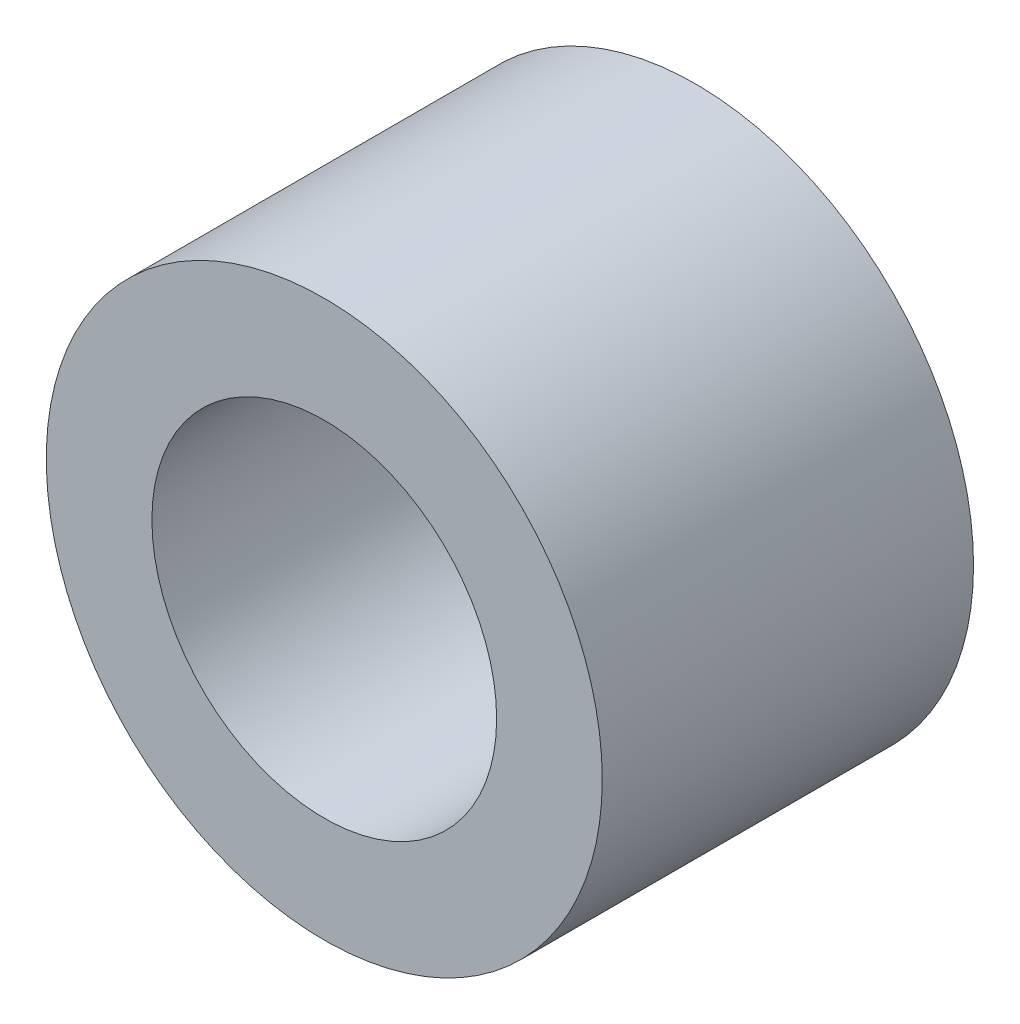
ISO-10303-21;
HEADER;
FILE_DESCRIPTION(('STEP AP214'),'2;1');
FILE_NAME('part.step','',(''),(''),'','','');
FILE_SCHEMA(('AUTOMOTIVE_DESIGN { 1 0 10303 214 1 1 1 1 }'));
ENDSEC;
DATA;
#1=APPLICATION_CONTEXT('core data for automotive mechanical design processes');
#2=APPLICATION_PROTOCOL_DEFINITION('international standard','automotive_design',2000,#1);
#3=PRODUCT_CONTEXT('',#1,'mechanical');
#4=PRODUCT('Part','Part','',(#3));
#5=PRODUCT_RELATED_PRODUCT_CATEGORY('part','',(#4));
#6=PRODUCT_DEFINITION_FORMATION('','',#4);
#7=PRODUCT_DEFINITION_CONTEXT('part definition',#1,'design');
#8=PRODUCT_DEFINITION('design','',#6,#7);
#9=PRODUCT_DEFINITION_SHAPE('','',#8);
#10=(LENGTH_UNIT() NAMED_UNIT(*) SI_UNIT(.MILLI.,.METRE.));
#11=(NAMED_UNIT(*) PLANE_ANGLE_UNIT() SI_UNIT($,.RADIAN.));
#12=(NAMED_UNIT(*) SI_UNIT($,.STERADIAN.) SOLID_ANGLE_UNIT());
#13=UNCERTAINTY_MEASURE_WITH_UNIT(LENGTH_MEASURE(1.E-05),#10,'distance_accuracy_value','');
#14=(GEOMETRIC_REPRESENTATION_CONTEXT(3) GLOBAL_UNCERTAINTY_ASSIGNED_CONTEXT((#13)) GLOBAL_UNIT_ASSIGNED_CONTEXT((#10,
#11,#12)) REPRESENTATION_CONTEXT('',''));
#15=CARTESIAN_POINT('',(0.,0.,0.));
#16=DIRECTION('',(0.,0.,1.));
#17=DIRECTION('',(1.,0.,0.));
#18=AXIS2_PLACEMENT_3D('',#15,#16,#17);
#19=CARTESIAN_POINT('',(0.,0.,26.924));
#20=DIRECTION('',(0.,0.,1.));
#21=DIRECTION('',(1.,0.,0.));
#22=AXIS2_PLACEMENT_3D('',#19,#20,#21);
#23=PLANE('',#22);
#24=CARTESIAN_POINT('',(0.,0.,26.924));
#25=DIRECTION('',(0.,0.,1.));
#26=DIRECTION('',(1.,0.,0.));
#27=AXIS2_PLACEMENT_3D('',#24,#25,#26);
#28=CIRCLE('',#27,20.158634308);
#29=CARTESIAN_POINT('',(20.158634308,0.,26.924));
#30=VERTEX_POINT('',#29);
#31=EDGE_CURVE('E10',#30,#30,#28,.T.);
#32=ORIENTED_EDGE('',*,*,#31,.T.);
#33=EDGE_LOOP('',(#32));
#34=FACE_BOUND('',#33,.T.);
#35=CARTESIAN_POINT('',(0.,0.,26.924));
#36=DIRECTION('',(0.,0.,1.));
#37=DIRECTION('',(1.,0.,0.));
#38=AXIS2_PLACEMENT_3D('',#35,#36,#37);
#39=CIRCLE('',#38,12.500000019);
#40=CARTESIAN_POINT('',(12.500000019,0.,26.924));
#41=VERTEX_POINT('',#40);
#42=EDGE_CURVE('E56',#41,#41,#39,.T.);
#43=ORIENTED_EDGE('',*,*,#42,.F.);
#44=EDGE_LOOP('',(#43));
#45=FACE_BOUND('',#44,.T.);
#46=ADVANCED_FACE('F43',(#34,#45),#23,.T.);
#47=CARTESIAN_POINT('',(0.,0.,0.));
#48=DIRECTION('',(0.,0.,1.));
#49=DIRECTION('',(1.,0.,0.));
#50=AXIS2_PLACEMENT_3D('',#47,#48,#49);
#51=PLANE('',#50);
#52=CARTESIAN_POINT('',(0.,0.,0.));
#53=DIRECTION('',(0.,0.,1.));
#54=DIRECTION('',(1.,0.,0.));
#55=AXIS2_PLACEMENT_3D('',#52,#53,#54);
#56=CIRCLE('',#55,20.158634308);
#57=CARTESIAN_POINT('',(20.158634308,0.,0.));
#58=VERTEX_POINT('',#57);
#59=EDGE_CURVE('E47',#58,#58,#56,.T.);
#60=ORIENTED_EDGE('',*,*,#59,.F.);
#61=EDGE_LOOP('',(#60));
#62=FACE_BOUND('',#61,.T.);
#63=CARTESIAN_POINT('',(0.,0.,0.));
#64=DIRECTION('',(0.,0.,1.));
#65=DIRECTION('',(1.,0.,0.));
#66=AXIS2_PLACEMENT_3D('',#63,#64,#65);
#67=CIRCLE('',#66,12.500000019);
#68=CARTESIAN_POINT('',(12.500000019,0.,0.));
#69=VERTEX_POINT('',#68);
#70=EDGE_CURVE('E58',#69,#69,#67,.T.);
#71=ORIENTED_EDGE('',*,*,#70,.T.);
#72=EDGE_LOOP('',(#71));
#73=FACE_BOUND('',#72,.T.);
#74=ADVANCED_FACE('F70',(#62,#73),#51,.F.);
#75=CARTESIAN_POINT('',(0.,0.,26.924));
#76=DIRECTION('',(0.,0.,-1.));
#77=DIRECTION('',(-1.,0.,0.));
#78=AXIS2_PLACEMENT_3D('',#75,#76,#77);
#79=CYLINDRICAL_SURFACE('',#78,20.158634308);
#80=ORIENTED_EDGE('',*,*,#31,.F.);
#81=EDGE_LOOP('',(#80));
#82=FACE_BOUND('',#81,.T.);
#83=ORIENTED_EDGE('',*,*,#59,.T.);
#84=EDGE_LOOP('',(#83));
#85=FACE_BOUND('',#84,.T.);
#86=ADVANCED_FACE('F45',(#82,#85),#79,.T.);
#87=CARTESIAN_POINT('',(0.,0.,26.924));
#88=DIRECTION('',(0.,0.,-1.));
#89=DIRECTION('',(-1.,0.,0.));
#90=AXIS2_PLACEMENT_3D('',#87,#88,#89);
#91=CYLINDRICAL_SURFACE('',#90,12.500000019);
#92=ORIENTED_EDGE('',*,*,#42,.T.);
#93=EDGE_LOOP('',(#92));
#94=FACE_BOUND('',#93,.T.);
#95=ORIENTED_EDGE('',*,*,#70,.F.);
#96=EDGE_LOOP('',(#95));
#97=FACE_BOUND('',#96,.T.);
#98=ADVANCED_FACE('F66',(#94,#97),#91,.F.);
#99=CLOSED_SHELL('',(#46,#74,#86,#98));
#100=MANIFOLD_SOLID_BREP('B2',#99);
#101=ADVANCED_BREP_SHAPE_REPRESENTATION('',(#18,#100),#14);
#102=SHAPE_DEFINITION_REPRESENTATION(#9,#101);
ENDSEC;
END-ISO-10303-21;
